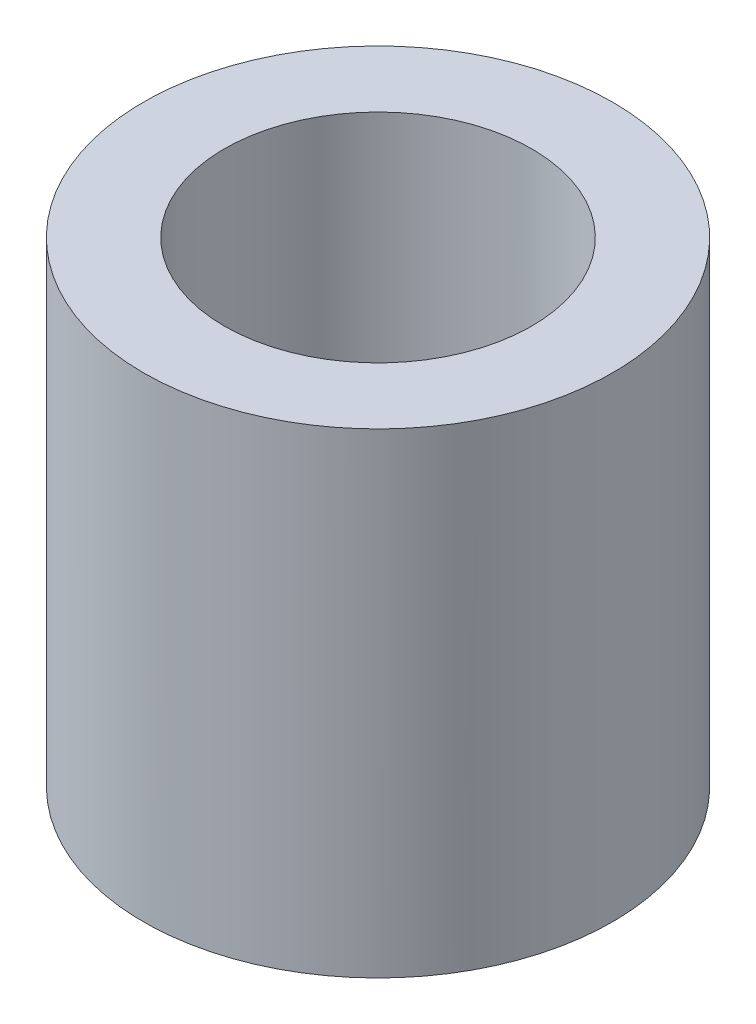
ISO-10303-21;
HEADER;
FILE_DESCRIPTION(('STEP AP214'),'2;1');
FILE_NAME('part.step','',(''),(''),'','','');
FILE_SCHEMA(('AUTOMOTIVE_DESIGN { 1 0 10303 214 1 1 1 1 }'));
ENDSEC;
DATA;
#1=APPLICATION_CONTEXT('core data for automotive mechanical design processes');
#2=APPLICATION_PROTOCOL_DEFINITION('international standard','automotive_design',2000,#1);
#3=PRODUCT_CONTEXT('',#1,'mechanical');
#4=PRODUCT('Part','Part','',(#3));
#5=PRODUCT_RELATED_PRODUCT_CATEGORY('part','',(#4));
#6=PRODUCT_DEFINITION_FORMATION('','',#4);
#7=PRODUCT_DEFINITION_CONTEXT('part definition',#1,'design');
#8=PRODUCT_DEFINITION('design','',#6,#7);
#9=PRODUCT_DEFINITION_SHAPE('','',#8);
#10=(LENGTH_UNIT() NAMED_UNIT(*) SI_UNIT(.MILLI.,.METRE.));
#11=(NAMED_UNIT(*) PLANE_ANGLE_UNIT() SI_UNIT($,.RADIAN.));
#12=(NAMED_UNIT(*) SI_UNIT($,.STERADIAN.) SOLID_ANGLE_UNIT());
#13=UNCERTAINTY_MEASURE_WITH_UNIT(LENGTH_MEASURE(1.E-05),#10,'distance_accuracy_value','');
#14=(GEOMETRIC_REPRESENTATION_CONTEXT(3) GLOBAL_UNCERTAINTY_ASSIGNED_CONTEXT((#13)) GLOBAL_UNIT_ASSIGNED_CONTEXT((#10,
#11,#12)) REPRESENTATION_CONTEXT('',''));
#15=CARTESIAN_POINT('',(0.,0.,0.));
#16=DIRECTION('',(0.,0.,1.));
#17=DIRECTION('',(1.,0.,0.));
#18=AXIS2_PLACEMENT_3D('',#15,#16,#17);
#19=CARTESIAN_POINT('',(0.,58.8,0.));
#20=DIRECTION('',(0.,1.,0.));
#21=DIRECTION('',(0.,0.,1.));
#22=AXIS2_PLACEMENT_3D('',#19,#20,#21);
#23=PLANE('',#22);
#24=CARTESIAN_POINT('',(0.,58.8,0.));
#25=DIRECTION('',(0.,1.,0.));
#26=DIRECTION('',(0.,0.,1.));
#27=AXIS2_PLACEMENT_3D('',#24,#25,#26);
#28=CIRCLE('',#27,29.);
#29=CARTESIAN_POINT('',(0.,58.8,29.));
#30=VERTEX_POINT('',#29);
#31=EDGE_CURVE('E48',#30,#30,#28,.T.);
#32=ORIENTED_EDGE('',*,*,#31,.T.);
#33=EDGE_LOOP('',(#32));
#34=FACE_BOUND('',#33,.T.);
#35=CARTESIAN_POINT('',(0.,58.8,0.));
#36=DIRECTION('',(0.,1.,0.));
#37=DIRECTION('',(0.,0.,1.));
#38=AXIS2_PLACEMENT_3D('',#35,#36,#37);
#39=CIRCLE('',#38,19.);
#40=CARTESIAN_POINT('',(0.,58.8,19.));
#41=VERTEX_POINT('',#40);
#42=EDGE_CURVE('E79',#41,#41,#39,.T.);
#43=ORIENTED_EDGE('',*,*,#42,.F.);
#44=EDGE_LOOP('',(#43));
#45=FACE_BOUND('',#44,.T.);
#46=ADVANCED_FACE('F33',(#34,#45),#23,.T.);
#47=CARTESIAN_POINT('',(0.,0.,0.));
#48=DIRECTION('',(0.,1.,0.));
#49=DIRECTION('',(0.,0.,1.));
#50=AXIS2_PLACEMENT_3D('',#47,#48,#49);
#51=PLANE('',#50);
#52=CARTESIAN_POINT('',(0.,0.,0.));
#53=DIRECTION('',(0.,1.,0.));
#54=DIRECTION('',(0.,0.,1.));
#55=AXIS2_PLACEMENT_3D('',#52,#53,#54);
#56=CIRCLE('',#55,29.);
#57=CARTESIAN_POINT('',(-10.45,0.,-27.0517559504));
#58=VERTEX_POINT('',#57);
#59=CARTESIAN_POINT('',(10.45,0.,-27.0517559504));
#60=VERTEX_POINT('',#59);
#61=EDGE_CURVE('E75',#58,#60,#56,.T.);
#62=ORIENTED_EDGE('',*,*,#61,.F.);
#63=DIRECTION('',(0.,0.,1.));
#64=VECTOR('',#63,1.);
#65=CARTESIAN_POINT('',(-10.45,0.,-29.));
#66=LINE('',#65,#64);
#67=CARTESIAN_POINT('',(-10.45,0.,-15.8681284340656));
#68=VERTEX_POINT('',#67);
#69=EDGE_CURVE('E67',#58,#68,#66,.T.);
#70=ORIENTED_EDGE('',*,*,#69,.T.);
#71=CARTESIAN_POINT('',(0.,0.,0.));
#72=DIRECTION('',(0.,1.,0.));
#73=DIRECTION('',(0.,0.,1.));
#74=AXIS2_PLACEMENT_3D('',#71,#72,#73);
#75=CIRCLE('',#74,19.);
#76=CARTESIAN_POINT('',(10.45,0.,-15.8681284340656));
#77=VERTEX_POINT('',#76);
#78=EDGE_CURVE('E74',#68,#77,#75,.T.);
#79=ORIENTED_EDGE('',*,*,#78,.T.);
#80=DIRECTION('',(0.,0.,1.));
#81=VECTOR('',#80,1.);
#82=CARTESIAN_POINT('',(10.45,0.,-29.));
#83=LINE('',#82,#81);
#84=EDGE_CURVE('E54',#77,#60,#83,.F.);
#85=ORIENTED_EDGE('',*,*,#84,.T.);
#86=EDGE_LOOP('',(#62,#70,#79,#85));
#87=FACE_BOUND('',#86,.T.);
#88=ADVANCED_FACE('F73',(#87),#51,.F.);
#89=CARTESIAN_POINT('',(0.,58.8,0.));
#90=DIRECTION('',(0.,-1.,0.));
#91=DIRECTION('',(0.,0.,-1.));
#92=AXIS2_PLACEMENT_3D('',#89,#90,#91);
#93=CYLINDRICAL_SURFACE('',#92,29.);
#94=ORIENTED_EDGE('',*,*,#31,.F.);
#95=EDGE_LOOP('',(#94));
#96=FACE_BOUND('',#95,.T.);
#97=ORIENTED_EDGE('',*,*,#61,.T.);
#98=CARTESIAN_POINT('',(10.45,0.,-27.0517559504));
#99=CARTESIAN_POINT('',(10.4500420347106,0.283585804592823,-27.0517043468938));
#100=CARTESIAN_POINT('',(10.4384582900409,0.567151510875765,-27.0562135064838));
#101=CARTESIAN_POINT('',(10.3923533101106,1.13205072400223,-27.0739748153919));
#102=CARTESIAN_POINT('',(10.3578392161113,1.41338489822269,-27.0872242426955));
#103=CARTESIAN_POINT('',(10.2663397274534,1.97087917695194,-27.1220299848386));
#104=CARTESIAN_POINT('',(10.2094294851695,2.24705338273331,-27.1435585129283));
#105=CARTESIAN_POINT('',(10.0736989221395,2.79325434716323,-27.1942248619088));
#106=CARTESIAN_POINT('',(9.99487760715423,3.06328082625018,-27.2233630280918));
#107=CARTESIAN_POINT('',(9.81612541506079,3.59510931804701,-27.2883252534546));
#108=CARTESIAN_POINT('',(9.71621576569784,3.85691929941826,-27.3241425851209));
#109=CARTESIAN_POINT('',(9.49602608490443,4.37106727613591,-27.4014434152163));
#110=CARTESIAN_POINT('',(9.37573845850376,4.62340169690089,-27.4429290251205));
#111=CARTESIAN_POINT('',(9.11565980665934,5.11714193370589,-27.5304116973908));
#112=CARTESIAN_POINT('',(8.97585950061418,5.35854247659465,-27.5764109033989));
#113=CARTESIAN_POINT('',(8.67774496392956,5.82896168700296,-27.6716682434378));
#114=CARTESIAN_POINT('',(8.51942948657005,6.05797951921194,-27.7209265968263));
#115=CARTESIAN_POINT('',(8.1783532178767,6.51159426030976,-27.8235070049463));
#116=CARTESIAN_POINT('',(7.99485172295566,6.73561558672429,-27.8769128700475));
#117=CARTESIAN_POINT('',(7.60999364051448,7.16757833346485,-27.984422606139));
#118=CARTESIAN_POINT('',(7.4086366635212,7.37551940285456,-28.038526492333));
#119=CARTESIAN_POINT('',(6.98922455227901,7.77412060648809,-28.1460051192098));
#120=CARTESIAN_POINT('',(6.77116606714592,7.96477725605234,-28.1993797110269));
#121=CARTESIAN_POINT('',(6.31966720373456,8.32755481379228,-28.30398376654));
#122=CARTESIAN_POINT('',(6.08622729607372,8.49967628865505,-28.355213295789));
#123=CARTESIAN_POINT('',(5.59776540045549,8.82932821910676,-28.4557396366489));
#124=CARTESIAN_POINT('',(5.34229576701858,8.986230332314,-28.5049251534368));
#125=CARTESIAN_POINT('',(4.81819953670834,9.27778716658057,-28.598177522385));
#126=CARTESIAN_POINT('',(4.54957824539635,9.41245076463952,-28.6422464148639));
#127=CARTESIAN_POINT('',(4.0009304665911,9.65843806556188,-28.7240224277536));
#128=CARTESIAN_POINT('',(3.72090469945483,9.76976323986082,-28.7617299492052));
#129=CARTESIAN_POINT('',(3.15147124006535,9.96802916322205,-28.829679557322));
#130=CARTESIAN_POINT('',(2.86206402532538,10.0549711512148,-28.8599220232835));
#131=CARTESIAN_POINT('',(2.28785493498111,10.2006078672093,-28.9109917080171));
#132=CARTESIAN_POINT('',(2.00333408881766,10.2602958883597,-28.9321479733921));
#133=CARTESIAN_POINT('',(1.42982129044734,10.3558008358569,-28.9661546281748));
#134=CARTESIAN_POINT('',(1.14082944731271,10.3916183436005,-28.9790052198775));
#135=CARTESIAN_POINT('',(0.560678879709506,10.4390050128558,-28.9960313858068));
#136=CARTESIAN_POINT('',(0.269520689891153,10.4505799703893,-29.0002090335992));
#137=CARTESIAN_POINT('',(-0.31273480642599,10.4493753534977,-28.9997748676108));
#138=CARTESIAN_POINT('',(-0.603832114382944,10.4365964510194,-28.9951632963333));
#139=CARTESIAN_POINT('',(-1.17038196262185,10.3879645535838,-28.9776953432902));
#140=CARTESIAN_POINT('',(-1.44594031930986,10.3531953700735,-28.9652263232188));
#141=CARTESIAN_POINT('',(-1.99297364278444,10.2619415628104,-28.9327345282788));
#142=CARTESIAN_POINT('',(-2.2644487568015,10.2054577239883,-28.9127120264502));
#143=CARTESIAN_POINT('',(-2.80148216586523,10.0712861933875,-28.865625989761));
#144=CARTESIAN_POINT('',(-3.06704032483466,9.99359801449789,-28.8385622931492));
#145=CARTESIAN_POINT('',(-3.59051770846455,9.81768465557462,-28.7780752435371));
#146=CARTESIAN_POINT('',(-3.84843674464674,9.71945896930502,-28.7446517337734));
#147=CARTESIAN_POINT('',(-4.35857346083338,9.50175322503744,-28.6717657468143));
#148=CARTESIAN_POINT('',(-4.61066189598388,9.3819964742849,-28.6322257208561));
#149=CARTESIAN_POINT('',(-5.10393720166782,9.12304511944778,-28.5484227923349));
#150=CARTESIAN_POINT('',(-5.34512009308555,8.98384349505191,-28.5041581853929));
#151=CARTESIAN_POINT('',(-5.81513787141559,8.68699808555991,-28.411996307252));
#152=CARTESIAN_POINT('',(-6.04397205581614,8.52935325285172,-28.3640988297529));
#153=CARTESIAN_POINT('',(-6.48804335191334,8.1966322135266,-28.2658277976439));
#154=CARTESIAN_POINT('',(-6.70327959286284,8.02155489246214,-28.2154540848342));
#155=CARTESIAN_POINT('',(-7.13029934974788,7.64504397370423,-28.1106697752738));
#156=CARTESIAN_POINT('',(-7.34125927844249,7.44269503889725,-28.0561885814523));
#157=CARTESIAN_POINT('',(-7.74550895494482,7.02103284406633,-27.947288313059));
#158=CARTESIAN_POINT('',(-7.9387981319775,6.80171903648976,-27.8928692405497));
#159=CARTESIAN_POINT('',(-8.30657087260514,6.34734883598967,-27.7855645190033));
#160=CARTESIAN_POINT('',(-8.48104707362154,6.11228633764513,-27.7326794761947));
#161=CARTESIAN_POINT('',(-8.80993426692911,5.62789953315669,-27.6299610342489));
#162=CARTESIAN_POINT('',(-8.96434614832551,5.3785758596703,-27.5801274999428));
#163=CARTESIAN_POINT('',(-9.25486016428927,4.86205670217147,-27.4840217354911));
#164=CARTESIAN_POINT('',(-9.39053562890229,4.59460392829616,-27.43784037231));
#165=CARTESIAN_POINT('',(-9.63865789391978,4.04830032260089,-27.3516640412208));
#166=CARTESIAN_POINT('',(-9.75111447705434,3.76945435060087,-27.311666469709));
#167=CARTESIAN_POINT('',(-9.9517074600007,3.20254736052535,-27.2392162699204));
#168=CARTESIAN_POINT('',(-10.0398714660334,2.91449722119139,-27.2067550839143));
#169=CARTESIAN_POINT('',(-10.1911151141635,2.33118500341955,-27.1504632228316));
#170=CARTESIAN_POINT('',(-10.2542061224131,2.03592625738507,-27.1266286375619));
#171=CARTESIAN_POINT('',(-10.3527968321001,1.45141628125275,-27.0891570823594));
#172=CARTESIAN_POINT('',(-10.3892264665924,1.16234383490704,-27.0751771130261));
#173=CARTESIAN_POINT('',(-10.43783778974,0.58218876895395,-27.0564531568833));
#174=CARTESIAN_POINT('',(-10.4500455895101,0.291108653783103,-27.0516992245359));
#175=CARTESIAN_POINT('',(-10.45,0.,-27.0517559504));
#176=B_SPLINE_CURVE_WITH_KNOTS('',3,(#98,#99,#100,#101,#102,#103,#104,#105,#106,#107,#108,#109,
#110,#111,#112,#113,#114,#115,#116,#117,#118,#119,#120,#121,#122,#123,#124,#125,#126,#127,#128,
#129,#130,#131,#132,#133,#134,#135,#136,#137,#138,#139,#140,#141,#142,#143,#144,#145,#146,#147,
#148,#149,#150,#151,#152,#153,#154,#155,#156,#157,#158,#159,#160,#161,#162,#163,#164,#165,#166,
#167,#168,#169,#170,#171,#172,#173,#174,#175),.UNSPECIFIED.,.F.,.F.,(4,2,2,2,2,2,2,2,2,2,2,2,2,
2,2,2,2,2,2,2,2,2,2,2,2,2,2,2,2,2,2,2,2,2,2,2,2,2,4),(0.,0.850453833766532,1.70064293244988,
2.54800314028428,3.39540180430426,4.24195150128671,5.08881740836092,5.93608748226966,
6.7834146400372,7.66582218735498,8.54824898694583,9.43085329714968,10.3134306152938,
11.223737519741,12.133680171924,13.0435654369885,13.9534044616266,14.8267426200457,
15.7000595064273,16.5731675722934,17.4462515486034,18.2793406273302,19.1123995947931,
19.9454777010853,20.7785763446223,21.6232656368351,22.4682606848241,23.3133037535895,
24.1584008801308,25.0494334564846,25.9404948035209,26.8319036170085,27.7232729162381,
28.6324226357712,29.5411885212372,30.4489173803231,31.3562342748872,32.230161380644,
33.1031458808552),.UNSPECIFIED.);
#177=EDGE_CURVE('E60',#60,#58,#176,.T.);
#178=ORIENTED_EDGE('',*,*,#177,.T.);
#179=EDGE_LOOP('',(#97,#178));
#180=FACE_BOUND('',#179,.T.);
#181=ADVANCED_FACE('F35',(#96,#180),#93,.T.);
#182=CARTESIAN_POINT('',(0.,58.8,0.));
#183=DIRECTION('',(0.,-1.,0.));
#184=DIRECTION('',(0.,0.,-1.));
#185=AXIS2_PLACEMENT_3D('',#182,#183,#184);
#186=CYLINDRICAL_SURFACE('',#185,19.);
#187=CARTESIAN_POINT('',(10.45,0.,-15.8681284340656));
#188=CARTESIAN_POINT('',(10.4500012730181,0.13461668501087,-15.8681246559729));
#189=CARTESIAN_POINT('',(10.4473981935161,0.269213552162404,-15.8698422115779));
#190=CARTESIAN_POINT('',(10.4370032538798,0.53811301378984,-15.8766816326083));
#191=CARTESIAN_POINT('',(10.4292116748264,0.672415623811373,-15.8818033136192));
#192=CARTESIAN_POINT('',(10.3981046596639,1.07425060990325,-15.9022035166576));
#193=CARTESIAN_POINT('',(10.3670568574151,1.34098374106069,-15.9225173529007));
#194=CARTESIAN_POINT('',(10.2850919997626,1.86818286049645,-15.9755820898262));
#195=CARTESIAN_POINT('',(10.2343115002847,2.12867913282309,-16.0082474732981));
#196=CARTESIAN_POINT('',(10.1135634255716,2.6435306280742,-16.0848045161732));
#197=CARTESIAN_POINT('',(10.0435929241274,2.89788490798894,-16.1286978876201));
#198=CARTESIAN_POINT('',(9.88553018246523,3.39814977169438,-16.2260552771701));
#199=CARTESIAN_POINT('',(9.79749089995467,3.64408263393227,-16.2794912687168));
#200=CARTESIAN_POINT('',(9.60403995683278,4.12705630531565,-16.3943606685431));
#201=CARTESIAN_POINT('',(9.49862864822693,4.36409729451573,-16.4557939147708));
#202=CARTESIAN_POINT('',(9.27108162313205,4.82872471800875,-16.5850592272797));
#203=CARTESIAN_POINT('',(9.14891684383235,5.0562938067302,-16.6529023479392));
#204=CARTESIAN_POINT('',(8.88879269546811,5.50074339969534,-16.7931891214218));
#205=CARTESIAN_POINT('',(8.75083177189294,5.71762284895399,-16.8656332267182));
#206=CARTESIAN_POINT('',(8.44524660649842,6.16116284753757,-17.0208707913538));
#207=CARTESIAN_POINT('',(8.27603504615457,6.38662283459905,-17.1039735239912));
#208=CARTESIAN_POINT('',(7.92025692286624,6.82284825455657,-17.2716010378501));
#209=CARTESIAN_POINT('',(7.73368933213889,7.03361281592981,-17.356125903044));
#210=CARTESIAN_POINT('',(7.34394254747332,7.43963895807659,-17.5245996758007));
#211=CARTESIAN_POINT('',(7.14075577283886,7.63489338308758,-17.6085483013791));
#212=CARTESIAN_POINT('',(6.71875429802652,8.00876285843584,-17.7738481776533));
#213=CARTESIAN_POINT('',(6.49994473541626,8.18738333474212,-17.8552002696029));
#214=CARTESIAN_POINT('',(6.02796580951805,8.54169470713606,-18.0203050555937));
#215=CARTESIAN_POINT('',(5.77346113451382,8.71579938254646,-18.1036579714908));
#216=CARTESIAN_POINT('',(5.2482990315859,9.04175683559255,-18.262821138262));
#217=CARTESIAN_POINT('',(4.97764042634378,9.19360798857028,-18.3386308383007));
#218=CARTESIAN_POINT('',(4.42196345972371,9.47340695365971,-18.4804871163755));
#219=CARTESIAN_POINT('',(4.13695324241697,9.60136813271735,-18.5465391496878));
#220=CARTESIAN_POINT('',(3.55446192453809,9.83190572268642,-18.6669279387466));
#221=CARTESIAN_POINT('',(3.25698249065589,9.93448551361228,-18.7212662542732));
#222=CARTESIAN_POINT('',(2.67716156036429,10.1053902418416,-18.8125395654125));
#223=CARTESIAN_POINT('',(2.39561869371007,10.1758545416881,-18.8505461022332));
#224=CARTESIAN_POINT('',(1.82629028871862,10.2932803825418,-18.9141925377618));
#225=CARTESIAN_POINT('',(1.53850506778544,10.3402431156203,-18.9398330637093));
#226=CARTESIAN_POINT('',(0.959332065107871,10.4099571173657,-18.9779834579204));
#227=CARTESIAN_POINT('',(0.667946639160721,10.4327234497428,-18.9905014956532));
#228=CARTESIAN_POINT('',(0.0840349414601844,10.4537440281592,-19.0020572982258));
#229=CARTESIAN_POINT('',(-0.208491238125641,10.4520002150995,-19.0010961304523));
#230=CARTESIAN_POINT('',(-0.761381928150845,10.4255062807613,-18.986537018077));
#231=CARTESIAN_POINT('',(-1.02190258118581,10.403187633873,-18.97427465686));
#232=CARTESIAN_POINT('',(-1.53982717952239,10.3392215954069,-18.9392788647418));
#233=CARTESIAN_POINT('',(-1.79723139030732,10.2975758623221,-18.9165463323066));
#234=CARTESIAN_POINT('',(-2.30717744119805,10.1954431478755,-18.8611432232997));
#235=CARTESIAN_POINT('',(-2.55971918993879,10.1349558128485,-18.8284724601834));
#236=CARTESIAN_POINT('',(-3.05834942150661,9.9957993910089,-18.7539343956568));
#237=CARTESIAN_POINT('',(-3.30443765326291,9.9171295979821,-18.7120667370384));
#238=CARTESIAN_POINT('',(-3.79129051288054,9.74147282440722,-18.6195639348381));
#239=CARTESIAN_POINT('',(-4.03197210941065,9.64430218314055,-18.5688413468723));
#240=CARTESIAN_POINT('',(-4.50414244029669,9.4330338050988,-18.4599953673567));
#241=CARTESIAN_POINT('',(-4.73562783881112,9.31892999576797,-18.4018693218507));
#242=CARTESIAN_POINT('',(-5.18824121521788,9.07473258130145,-18.279417775016));
#243=CARTESIAN_POINT('',(-5.40937044515481,8.94464091600042,-18.215093025991));
#244=CARTESIAN_POINT('',(-5.8404943223379,8.66928944402046,-18.0814707607809));
#245=CARTESIAN_POINT('',(-6.05048492934414,8.52402418949034,-18.0121714613699));
#246=CARTESIAN_POINT('',(-6.48046570029448,8.2027814443386,-17.8622736907849));
#247=CARTESIAN_POINT('',(-6.69910080414365,8.02518116012106,-17.781261737982));
#248=CARTESIAN_POINT('',(-7.12080538383843,7.65347289427305,-17.6166222801085));
#249=CARTESIAN_POINT('',(-7.32387371151187,7.45936369720356,-17.5329945827455));
#250=CARTESIAN_POINT('',(-7.71384060763867,7.0553580762284,-17.3649587686544));
#251=CARTESIAN_POINT('',(-7.90071979251648,6.84544327479169,-17.2805498467567));
#252=CARTESIAN_POINT('',(-8.2572086769888,6.41092680055438,-17.1130738002932));
#253=CARTESIAN_POINT('',(-8.42681820307707,6.18632498023224,-17.0300066892155));
#254=CARTESIAN_POINT('',(-8.76216156562717,5.7027287767172,-16.8600984974949));
#255=CARTESIAN_POINT('',(-8.92621372321557,5.44245142974372,-16.773577332291));
#256=CARTESIAN_POINT('',(-9.23157338358674,4.90669188661799,-16.6074766862903));
#257=CARTESIAN_POINT('',(-9.37287755167582,4.63120746915157,-16.5278982240262));
#258=CARTESIAN_POINT('',(-9.63098465736375,4.06725341716414,-16.3788369713242));
#259=CARTESIAN_POINT('',(-9.74785006769433,3.77881923955142,-16.3093285822235));
#260=CARTESIAN_POINT('',(-9.95602284359849,3.1902117094276,-16.1830919535635));
#261=CARTESIAN_POINT('',(-10.0473407557039,2.89004325956497,-16.1263584421653));
#262=CARTESIAN_POINT('',(-10.1785121378221,2.37632489918034,-16.0437477570263));
#263=CARTESIAN_POINT('',(-10.2255185262193,2.16522953748394,-16.0137780908027));
#264=CARTESIAN_POINT('',(-10.3064606327971,1.73961768410317,-15.9618037153635));
#265=CARTESIAN_POINT('',(-10.3404001006948,1.52510219229721,-15.9397967212684));
#266=CARTESIAN_POINT('',(-10.3949890356453,1.09284314467457,-15.9042551230562));
#267=CARTESIAN_POINT('',(-10.4155869370567,0.875090352569285,-15.8907533975621));
#268=CARTESIAN_POINT('',(-10.443108726044,0.438231926282305,-15.8726660496449));
#269=CARTESIAN_POINT('',(-10.4500248155989,0.219125591959078,-15.8680855119231));
#270=CARTESIAN_POINT('',(-10.45,0.,-15.8681284340656));
#271=B_SPLINE_CURVE_WITH_KNOTS('',3,(#187,#188,#189,#190,#191,#192,#193,#194,#195,#196,#197,
#198,#199,#200,#201,#202,#203,#204,#205,#206,#207,#208,#209,#210,#211,#212,#213,#214,#215,#216,
#217,#218,#219,#220,#221,#222,#223,#224,#225,#226,#227,#228,#229,#230,#231,#232,#233,#234,#235,
#236,#237,#238,#239,#240,#241,#242,#243,#244,#245,#246,#247,#248,#249,#250,#251,#252,#253,#254,
#255,#256,#257,#258,#259,#260,#261,#262,#263,#264,#265,#266,#267,#268,#269,#270),.UNSPECIFIED.,
.F.,.F.,(4,2,2,2,2,2,2,2,2,2,2,2,2,2,2,2,2,2,2,2,2,2,2,2,2,2,2,2,2,2,2,2,2,2,2,2,2,2,2,2,2,4),
(0.,0.403774900877858,0.807527929500476,1.61421634347208,2.41541890435949,3.21674370550549,
4.01575261388323,4.81474533411241,5.61514205241605,6.41561760618316,7.29637563173929,
8.17718584693272,9.05840010095439,9.93932588987509,10.896356113444,11.853456171935,
12.8100190971677,13.7664545692164,14.6433457334633,15.5201924145922,16.3964928857487,
17.2727239651172,18.0570787544756,18.8413662493439,19.6256684665201,20.4100011514402,
21.202569498715,21.9954227660016,22.7881799298052,23.5812227060215,24.4595921876933,
25.338026393811,26.2174982342825,27.0969789098324,28.0545593291095,29.0122799953022,
29.9675216788514,30.92236843516,31.5768566276699,32.2311568663348,32.8879711427837,
33.5451596662769),.UNSPECIFIED.);
#272=EDGE_CURVE('E11',#77,#68,#271,.T.);
#273=ORIENTED_EDGE('',*,*,#272,.F.);
#274=ORIENTED_EDGE('',*,*,#78,.F.);
#275=EDGE_LOOP('',(#273,#274));
#276=FACE_BOUND('',#275,.T.);
#277=ORIENTED_EDGE('',*,*,#42,.T.);
#278=EDGE_LOOP('',(#277));
#279=FACE_BOUND('',#278,.T.);
#280=ADVANCED_FACE('F77',(#276,#279),#186,.F.);
#281=CARTESIAN_POINT('',(0.,0.,-29.));
#282=DIRECTION('',(0.,0.,1.));
#283=DIRECTION('',(1.,0.,0.));
#284=AXIS2_PLACEMENT_3D('',#281,#282,#283);
#285=CYLINDRICAL_SURFACE('',#284,10.45);
#286=ORIENTED_EDGE('',*,*,#84,.F.);
#287=ORIENTED_EDGE('',*,*,#272,.T.);
#288=ORIENTED_EDGE('',*,*,#69,.F.);
#289=ORIENTED_EDGE('',*,*,#177,.F.);
#290=EDGE_LOOP('',(#286,#287,#288,#289));
#291=FACE_BOUND('',#290,.T.);
#292=ADVANCED_FACE('F66',(#291),#285,.F.);
#293=CLOSED_SHELL('',(#46,#88,#181,#280,#292));
#294=MANIFOLD_SOLID_BREP('B2',#293);
#295=ADVANCED_BREP_SHAPE_REPRESENTATION('',(#18,#294),#14);
#296=SHAPE_DEFINITION_REPRESENTATION(#9,#295);
ENDSEC;
END-ISO-10303-21;
